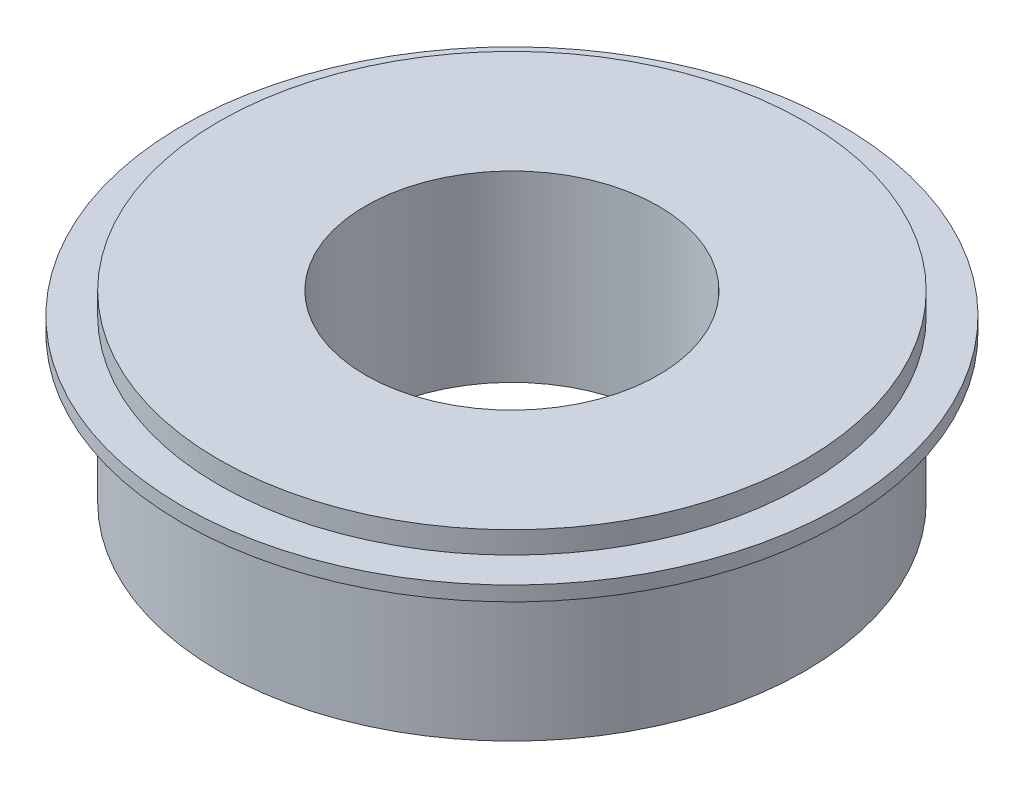
ISO-10303-21;
HEADER;
FILE_DESCRIPTION(('STEP AP214'),'2;1');
FILE_NAME('part.step','',(''),(''),'','','');
FILE_SCHEMA(('AUTOMOTIVE_DESIGN { 1 0 10303 214 1 1 1 1 }'));
ENDSEC;
DATA;
#1=APPLICATION_CONTEXT('core data for automotive mechanical design processes');
#2=APPLICATION_PROTOCOL_DEFINITION('international standard','automotive_design',2000,#1);
#3=PRODUCT_CONTEXT('',#1,'mechanical');
#4=PRODUCT('Part','Part','',(#3));
#5=PRODUCT_RELATED_PRODUCT_CATEGORY('part','',(#4));
#6=PRODUCT_DEFINITION_FORMATION('','',#4);
#7=PRODUCT_DEFINITION_CONTEXT('part definition',#1,'design');
#8=PRODUCT_DEFINITION('design','',#6,#7);
#9=PRODUCT_DEFINITION_SHAPE('','',#8);
#10=(LENGTH_UNIT() NAMED_UNIT(*) SI_UNIT(.MILLI.,.METRE.));
#11=(NAMED_UNIT(*) PLANE_ANGLE_UNIT() SI_UNIT($,.RADIAN.));
#12=(NAMED_UNIT(*) SI_UNIT($,.STERADIAN.) SOLID_ANGLE_UNIT());
#13=UNCERTAINTY_MEASURE_WITH_UNIT(LENGTH_MEASURE(1.E-05),#10,'distance_accuracy_value','');
#14=(GEOMETRIC_REPRESENTATION_CONTEXT(3) GLOBAL_UNCERTAINTY_ASSIGNED_CONTEXT((#13)) GLOBAL_UNIT_ASSIGNED_CONTEXT((#10,
#11,#12)) REPRESENTATION_CONTEXT('',''));
#15=CARTESIAN_POINT('',(0.,0.,0.));
#16=DIRECTION('',(0.,0.,1.));
#17=DIRECTION('',(1.,0.,0.));
#18=AXIS2_PLACEMENT_3D('',#15,#16,#17);
#19=CARTESIAN_POINT('',(0.,5.,0.));
#20=DIRECTION('',(0.,-1.,0.));
#21=DIRECTION('',(0.,0.,-1.));
#22=AXIS2_PLACEMENT_3D('',#19,#20,#21);
#23=CYLINDRICAL_SURFACE('',#22,8.);
#24=CARTESIAN_POINT('',(0.,0.,0.));
#25=DIRECTION('',(0.,1.,0.));
#26=DIRECTION('',(0.,0.,1.));
#27=AXIS2_PLACEMENT_3D('',#24,#25,#26);
#28=CIRCLE('',#27,8.);
#29=CARTESIAN_POINT('',(0.,0.,8.));
#30=VERTEX_POINT('',#29);
#31=EDGE_CURVE('E46',#30,#30,#28,.T.);
#32=ORIENTED_EDGE('',*,*,#31,.T.);
#33=EDGE_LOOP('',(#32));
#34=FACE_BOUND('',#33,.T.);
#35=CARTESIAN_POINT('',(0.,4.,0.));
#36=DIRECTION('',(0.,1.,0.));
#37=DIRECTION('',(0.,0.,1.));
#38=AXIS2_PLACEMENT_3D('',#35,#36,#37);
#39=CIRCLE('',#38,8.);
#40=CARTESIAN_POINT('',(0.,4.,8.));
#41=VERTEX_POINT('',#40);
#42=EDGE_CURVE('E10',#41,#41,#39,.T.);
#43=ORIENTED_EDGE('',*,*,#42,.F.);
#44=EDGE_LOOP('',(#43));
#45=FACE_BOUND('',#44,.T.);
#46=ADVANCED_FACE('F35',(#34,#45),#23,.T.);
#47=CARTESIAN_POINT('',(0.,5.,0.));
#48=DIRECTION('',(0.,1.,0.));
#49=DIRECTION('',(0.,0.,1.));
#50=AXIS2_PLACEMENT_3D('',#47,#48,#49);
#51=PLANE('',#50);
#52=CARTESIAN_POINT('',(0.,5.,0.));
#53=DIRECTION('',(0.,1.,0.));
#54=DIRECTION('',(0.,0.,1.));
#55=AXIS2_PLACEMENT_3D('',#52,#53,#54);
#56=CIRCLE('',#55,8.);
#57=CARTESIAN_POINT('',(0.,5.,8.));
#58=VERTEX_POINT('',#57);
#59=EDGE_CURVE('E42',#58,#58,#56,.T.);
#60=ORIENTED_EDGE('',*,*,#59,.T.);
#61=EDGE_LOOP('',(#60));
#62=FACE_BOUND('',#61,.T.);
#63=CARTESIAN_POINT('',(0.,5.,0.));
#64=DIRECTION('',(0.,1.,0.));
#65=DIRECTION('',(0.,0.,1.));
#66=AXIS2_PLACEMENT_3D('',#63,#64,#65);
#67=CIRCLE('',#66,4.);
#68=CARTESIAN_POINT('',(0.,5.,4.));
#69=VERTEX_POINT('',#68);
#70=EDGE_CURVE('E51',#69,#69,#67,.T.);
#71=ORIENTED_EDGE('',*,*,#70,.F.);
#72=EDGE_LOOP('',(#71));
#73=FACE_BOUND('',#72,.T.);
#74=ADVANCED_FACE('F90',(#62,#73),#51,.T.);
#75=CARTESIAN_POINT('',(0.,0.,0.));
#76=DIRECTION('',(0.,1.,0.));
#77=DIRECTION('',(0.,0.,1.));
#78=AXIS2_PLACEMENT_3D('',#75,#76,#77);
#79=PLANE('',#78);
#80=ORIENTED_EDGE('',*,*,#31,.F.);
#81=EDGE_LOOP('',(#80));
#82=FACE_BOUND('',#81,.T.);
#83=CARTESIAN_POINT('',(0.,0.,0.));
#84=DIRECTION('',(0.,1.,0.));
#85=DIRECTION('',(0.,0.,1.));
#86=AXIS2_PLACEMENT_3D('',#83,#84,#85);
#87=CIRCLE('',#86,4.);
#88=CARTESIAN_POINT('',(0.,0.,4.));
#89=VERTEX_POINT('',#88);
#90=EDGE_CURVE('E53',#89,#89,#87,.T.);
#91=ORIENTED_EDGE('',*,*,#90,.T.);
#92=EDGE_LOOP('',(#91));
#93=FACE_BOUND('',#92,.T.);
#94=ADVANCED_FACE('F95',(#82,#93),#79,.F.);
#95=CARTESIAN_POINT('',(0.,4.4,0.));
#96=DIRECTION('',(0.,1.,0.));
#97=DIRECTION('',(0.,0.,1.));
#98=AXIS2_PLACEMENT_3D('',#95,#96,#97);
#99=CIRCLE('',#98,8.);
#100=CARTESIAN_POINT('',(0.,4.4,8.));
#101=VERTEX_POINT('',#100);
#102=EDGE_CURVE('E62',#101,#101,#99,.T.);
#103=ORIENTED_EDGE('',*,*,#102,.T.);
#104=EDGE_LOOP('',(#103));
#105=FACE_BOUND('',#104,.T.);
#106=ORIENTED_EDGE('',*,*,#59,.F.);
#107=EDGE_LOOP('',(#106));
#108=FACE_BOUND('',#107,.T.);
#109=ADVANCED_FACE('F37',(#105,#108),#23,.T.);
#110=CARTESIAN_POINT('',(0.,5.,0.));
#111=DIRECTION('',(0.,-1.,0.));
#112=DIRECTION('',(0.,0.,-1.));
#113=AXIS2_PLACEMENT_3D('',#110,#111,#112);
#114=CYLINDRICAL_SURFACE('',#113,4.);
#115=ORIENTED_EDGE('',*,*,#70,.T.);
#116=EDGE_LOOP('',(#115));
#117=FACE_BOUND('',#116,.T.);
#118=ORIENTED_EDGE('',*,*,#90,.F.);
#119=EDGE_LOOP('',(#118));
#120=FACE_BOUND('',#119,.T.);
#121=ADVANCED_FACE('F79',(#117,#120),#114,.F.);
#122=CARTESIAN_POINT('',(0.,4.,0.));
#123=DIRECTION('',(0.,1.,0.));
#124=DIRECTION('',(0.,0.,1.));
#125=AXIS2_PLACEMENT_3D('',#122,#123,#124);
#126=CYLINDRICAL_SURFACE('',#125,9.);
#127=CARTESIAN_POINT('',(0.,4.,0.));
#128=DIRECTION('',(0.,1.,0.));
#129=DIRECTION('',(0.,0.,1.));
#130=AXIS2_PLACEMENT_3D('',#127,#128,#129);
#131=CIRCLE('',#130,9.);
#132=CARTESIAN_POINT('',(0.,4.,9.));
#133=VERTEX_POINT('',#132);
#134=EDGE_CURVE('E56',#133,#133,#131,.T.);
#135=ORIENTED_EDGE('',*,*,#134,.T.);
#136=EDGE_LOOP('',(#135));
#137=FACE_BOUND('',#136,.T.);
#138=CARTESIAN_POINT('',(0.,4.4,0.));
#139=DIRECTION('',(0.,1.,0.));
#140=DIRECTION('',(0.,0.,1.));
#141=AXIS2_PLACEMENT_3D('',#138,#139,#140);
#142=CIRCLE('',#141,9.);
#143=CARTESIAN_POINT('',(0.,4.4,9.));
#144=VERTEX_POINT('',#143);
#145=EDGE_CURVE('E59',#144,#144,#142,.T.);
#146=ORIENTED_EDGE('',*,*,#145,.F.);
#147=EDGE_LOOP('',(#146));
#148=FACE_BOUND('',#147,.T.);
#149=ADVANCED_FACE('F77',(#137,#148),#126,.T.);
#150=CARTESIAN_POINT('',(0.,4.,0.));
#151=DIRECTION('',(0.,1.,0.));
#152=DIRECTION('',(0.,0.,1.));
#153=AXIS2_PLACEMENT_3D('',#150,#151,#152);
#154=PLANE('',#153);
#155=ORIENTED_EDGE('',*,*,#42,.T.);
#156=EDGE_LOOP('',(#155));
#157=FACE_BOUND('',#156,.T.);
#158=ORIENTED_EDGE('',*,*,#134,.F.);
#159=EDGE_LOOP('',(#158));
#160=FACE_BOUND('',#159,.T.);
#161=ADVANCED_FACE('F73',(#157,#160),#154,.F.);
#162=CARTESIAN_POINT('',(0.,4.4,0.));
#163=DIRECTION('',(0.,1.,0.));
#164=DIRECTION('',(0.,0.,1.));
#165=AXIS2_PLACEMENT_3D('',#162,#163,#164);
#166=PLANE('',#165);
#167=ORIENTED_EDGE('',*,*,#102,.F.);
#168=EDGE_LOOP('',(#167));
#169=FACE_BOUND('',#168,.T.);
#170=ORIENTED_EDGE('',*,*,#145,.T.);
#171=EDGE_LOOP('',(#170));
#172=FACE_BOUND('',#171,.T.);
#173=ADVANCED_FACE('F70',(#169,#172),#166,.T.);
#174=CLOSED_SHELL('',(#46,#74,#94,#109,#121,#149,#161,#173));
#175=MANIFOLD_SOLID_BREP('B2',#174);
#176=ADVANCED_BREP_SHAPE_REPRESENTATION('',(#18,#175),#14);
#177=SHAPE_DEFINITION_REPRESENTATION(#9,#176);
ENDSEC;
END-ISO-10303-21;
